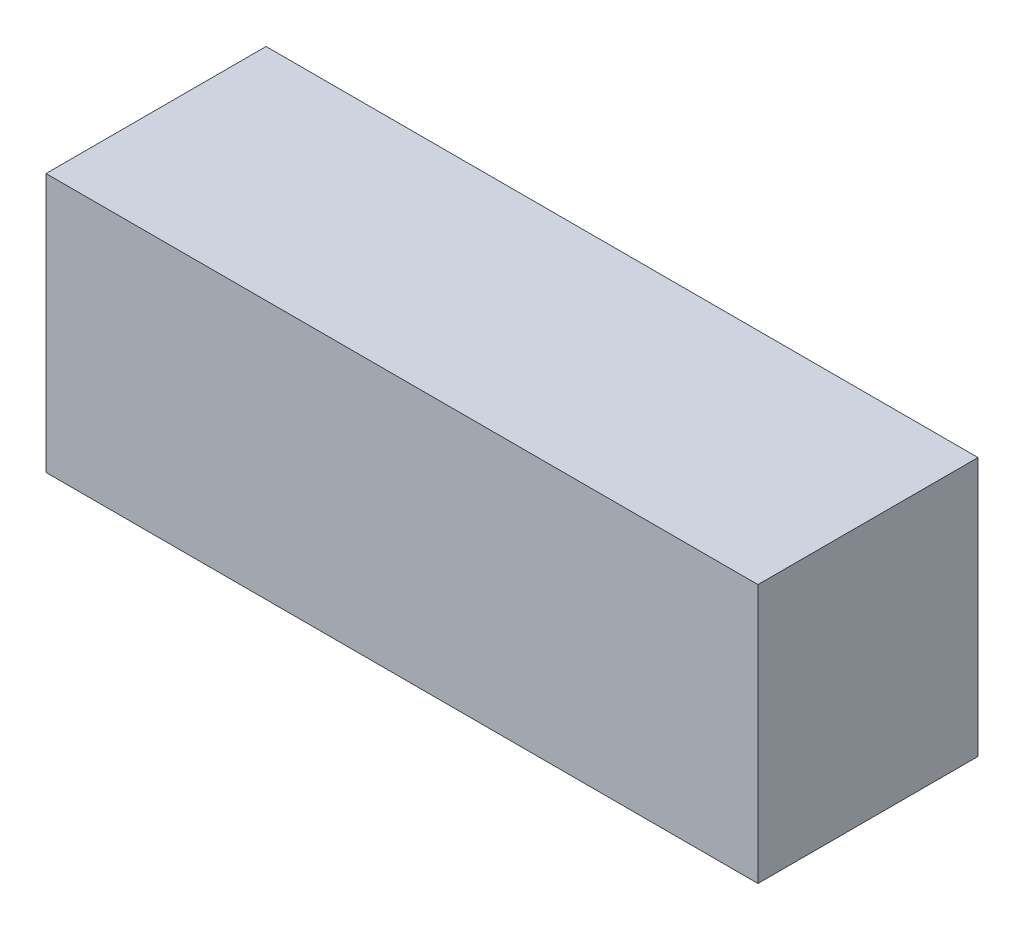
ISO-10303-21;
HEADER;
FILE_DESCRIPTION(('STEP AP214'),'2;1');
FILE_NAME('part.step','',(''),(''),'','','');
FILE_SCHEMA(('AUTOMOTIVE_DESIGN { 1 0 10303 214 1 1 1 1 }'));
ENDSEC;
DATA;
#1=APPLICATION_CONTEXT('core data for automotive mechanical design processes');
#2=APPLICATION_PROTOCOL_DEFINITION('international standard','automotive_design',2000,#1);
#3=PRODUCT_CONTEXT('',#1,'mechanical');
#4=PRODUCT('Part','Part','',(#3));
#5=PRODUCT_RELATED_PRODUCT_CATEGORY('part','',(#4));
#6=PRODUCT_DEFINITION_FORMATION('','',#4);
#7=PRODUCT_DEFINITION_CONTEXT('part definition',#1,'design');
#8=PRODUCT_DEFINITION('design','',#6,#7);
#9=PRODUCT_DEFINITION_SHAPE('','',#8);
#10=(LENGTH_UNIT() NAMED_UNIT(*) SI_UNIT(.MILLI.,.METRE.));
#11=(NAMED_UNIT(*) PLANE_ANGLE_UNIT() SI_UNIT($,.RADIAN.));
#12=(NAMED_UNIT(*) SI_UNIT($,.STERADIAN.) SOLID_ANGLE_UNIT());
#13=UNCERTAINTY_MEASURE_WITH_UNIT(LENGTH_MEASURE(1.E-05),#10,'distance_accuracy_value','');
#14=(GEOMETRIC_REPRESENTATION_CONTEXT(3) GLOBAL_UNCERTAINTY_ASSIGNED_CONTEXT((#13)) GLOBAL_UNIT_ASSIGNED_CONTEXT((#10,
#11,#12)) REPRESENTATION_CONTEXT('',''));
#15=CARTESIAN_POINT('',(0.,0.,0.));
#16=DIRECTION('',(0.,0.,1.));
#17=DIRECTION('',(1.,0.,0.));
#18=AXIS2_PLACEMENT_3D('',#15,#16,#17);
#19=CARTESIAN_POINT('',(27.5,20.,8.5));
#20=DIRECTION('',(-1.,0.,0.));
#21=DIRECTION('',(0.,0.,1.));
#22=AXIS2_PLACEMENT_3D('',#19,#20,#21);
#23=PLANE('',#22);
#24=DIRECTION('',(0.,0.,-1.));
#25=VECTOR('',#24,1.);
#26=CARTESIAN_POINT('',(27.5,0.,8.5));
#27=LINE('',#26,#25);
#28=CARTESIAN_POINT('',(27.5,0.,8.5));
#29=VERTEX_POINT('',#28);
#30=CARTESIAN_POINT('',(27.5,0.,-8.5));
#31=VERTEX_POINT('',#30);
#32=EDGE_CURVE('E111',#29,#31,#27,.T.);
#33=ORIENTED_EDGE('',*,*,#32,.T.);
#34=DIRECTION('',(0.,-1.,0.));
#35=VECTOR('',#34,1.);
#36=CARTESIAN_POINT('',(27.5,20.,-8.5));
#37=LINE('',#36,#35);
#38=CARTESIAN_POINT('',(27.5,20.,-8.5));
#39=VERTEX_POINT('',#38);
#40=EDGE_CURVE('E11',#39,#31,#37,.T.);
#41=ORIENTED_EDGE('',*,*,#40,.F.);
#42=DIRECTION('',(0.,0.,-1.));
#43=VECTOR('',#42,1.);
#44=CARTESIAN_POINT('',(27.5,20.,8.5));
#45=LINE('',#44,#43);
#46=CARTESIAN_POINT('',(27.5,20.,8.5));
#47=VERTEX_POINT('',#46);
#48=EDGE_CURVE('E95',#47,#39,#45,.T.);
#49=ORIENTED_EDGE('',*,*,#48,.F.);
#50=DIRECTION('',(0.,-1.,0.));
#51=VECTOR('',#50,1.);
#52=CARTESIAN_POINT('',(27.5,20.,8.5));
#53=LINE('',#52,#51);
#54=EDGE_CURVE('E107',#47,#29,#53,.T.);
#55=ORIENTED_EDGE('',*,*,#54,.T.);
#56=EDGE_LOOP('',(#33,#41,#49,#55));
#57=FACE_BOUND('',#56,.T.);
#58=ADVANCED_FACE('F43',(#57),#23,.F.);
#59=CARTESIAN_POINT('',(-27.5,20.,-8.5));
#60=DIRECTION('',(0.,0.,1.));
#61=DIRECTION('',(1.,0.,0.));
#62=AXIS2_PLACEMENT_3D('',#59,#60,#61);
#63=PLANE('',#62);
#64=DIRECTION('',(-1.,0.,0.));
#65=VECTOR('',#64,1.);
#66=CARTESIAN_POINT('',(-27.5,0.,-8.5));
#67=LINE('',#66,#65);
#68=CARTESIAN_POINT('',(-27.5,0.,-8.5));
#69=VERTEX_POINT('',#68);
#70=EDGE_CURVE('E100',#31,#69,#67,.T.);
#71=ORIENTED_EDGE('',*,*,#70,.T.);
#72=DIRECTION('',(0.,-1.,0.));
#73=VECTOR('',#72,1.);
#74=CARTESIAN_POINT('',(-27.5,20.,-8.5));
#75=LINE('',#74,#73);
#76=CARTESIAN_POINT('',(-27.5,20.,-8.5));
#77=VERTEX_POINT('',#76);
#78=EDGE_CURVE('E52',#77,#69,#75,.T.);
#79=ORIENTED_EDGE('',*,*,#78,.F.);
#80=DIRECTION('',(-1.,0.,0.));
#81=VECTOR('',#80,1.);
#82=CARTESIAN_POINT('',(-27.5,20.,-8.5));
#83=LINE('',#82,#81);
#84=EDGE_CURVE('E90',#39,#77,#83,.T.);
#85=ORIENTED_EDGE('',*,*,#84,.F.);
#86=ORIENTED_EDGE('',*,*,#40,.T.);
#87=EDGE_LOOP('',(#71,#79,#85,#86));
#88=FACE_BOUND('',#87,.T.);
#89=ADVANCED_FACE('F99',(#88),#63,.F.);
#90=CARTESIAN_POINT('',(-27.5,20.,8.5));
#91=DIRECTION('',(1.,0.,0.));
#92=DIRECTION('',(0.,0.,-1.));
#93=AXIS2_PLACEMENT_3D('',#90,#91,#92);
#94=PLANE('',#93);
#95=DIRECTION('',(0.,0.,1.));
#96=VECTOR('',#95,1.);
#97=CARTESIAN_POINT('',(-27.5,0.,8.5));
#98=LINE('',#97,#96);
#99=CARTESIAN_POINT('',(-27.5,0.,8.5));
#100=VERTEX_POINT('',#99);
#101=EDGE_CURVE('E77',#69,#100,#98,.T.);
#102=ORIENTED_EDGE('',*,*,#101,.T.);
#103=DIRECTION('',(0.,-1.,0.));
#104=VECTOR('',#103,1.);
#105=CARTESIAN_POINT('',(-27.5,20.,8.5));
#106=LINE('',#105,#104);
#107=CARTESIAN_POINT('',(-27.5,20.,8.5));
#108=VERTEX_POINT('',#107);
#109=EDGE_CURVE('E102',#108,#100,#106,.T.);
#110=ORIENTED_EDGE('',*,*,#109,.F.);
#111=DIRECTION('',(0.,0.,1.));
#112=VECTOR('',#111,1.);
#113=CARTESIAN_POINT('',(-27.5,20.,8.5));
#114=LINE('',#113,#112);
#115=EDGE_CURVE('E93',#77,#108,#114,.T.);
#116=ORIENTED_EDGE('',*,*,#115,.F.);
#117=ORIENTED_EDGE('',*,*,#78,.T.);
#118=EDGE_LOOP('',(#102,#110,#116,#117));
#119=FACE_BOUND('',#118,.T.);
#120=ADVANCED_FACE('F103',(#119),#94,.F.);
#121=CARTESIAN_POINT('',(-27.5,20.,8.5));
#122=DIRECTION('',(0.,0.,-1.));
#123=DIRECTION('',(-1.,0.,0.));
#124=AXIS2_PLACEMENT_3D('',#121,#122,#123);
#125=PLANE('',#124);
#126=DIRECTION('',(1.,0.,0.));
#127=VECTOR('',#126,1.);
#128=CARTESIAN_POINT('',(-27.5,0.,8.5));
#129=LINE('',#128,#127);
#130=EDGE_CURVE('E83',#100,#29,#129,.T.);
#131=ORIENTED_EDGE('',*,*,#130,.T.);
#132=ORIENTED_EDGE('',*,*,#54,.F.);
#133=DIRECTION('',(1.,0.,0.));
#134=VECTOR('',#133,1.);
#135=CARTESIAN_POINT('',(-27.5,20.,8.5));
#136=LINE('',#135,#134);
#137=EDGE_CURVE('E60',#108,#47,#136,.T.);
#138=ORIENTED_EDGE('',*,*,#137,.F.);
#139=ORIENTED_EDGE('',*,*,#109,.T.);
#140=EDGE_LOOP('',(#131,#132,#138,#139));
#141=FACE_BOUND('',#140,.T.);
#142=ADVANCED_FACE('F124',(#141),#125,.F.);
#143=CARTESIAN_POINT('',(0.,20.,0.));
#144=DIRECTION('',(0.,-1.,0.));
#145=DIRECTION('',(0.,0.,-1.));
#146=AXIS2_PLACEMENT_3D('',#143,#144,#145);
#147=PLANE('',#146);
#148=ORIENTED_EDGE('',*,*,#48,.T.);
#149=ORIENTED_EDGE('',*,*,#84,.T.);
#150=ORIENTED_EDGE('',*,*,#115,.T.);
#151=ORIENTED_EDGE('',*,*,#137,.T.);
#152=EDGE_LOOP('',(#148,#149,#150,#151));
#153=FACE_BOUND('',#152,.T.);
#154=ADVANCED_FACE('F91',(#153),#147,.F.);
#155=CARTESIAN_POINT('',(0.,0.,0.));
#156=DIRECTION('',(0.,-1.,0.));
#157=DIRECTION('',(0.,0.,-1.));
#158=AXIS2_PLACEMENT_3D('',#155,#156,#157);
#159=PLANE('',#158);
#160=ORIENTED_EDGE('',*,*,#32,.F.);
#161=ORIENTED_EDGE('',*,*,#130,.F.);
#162=ORIENTED_EDGE('',*,*,#101,.F.);
#163=ORIENTED_EDGE('',*,*,#70,.F.);
#164=EDGE_LOOP('',(#160,#161,#162,#163));
#165=FACE_BOUND('',#164,.T.);
#166=ADVANCED_FACE('F127',(#165),#159,.T.);
#167=CLOSED_SHELL('',(#58,#89,#120,#142,#154,#166));
#168=MANIFOLD_SOLID_BREP('B2',#167);
#169=ADVANCED_BREP_SHAPE_REPRESENTATION('',(#18,#168),#14);
#170=SHAPE_DEFINITION_REPRESENTATION(#9,#169);
ENDSEC;
END-ISO-10303-21;
